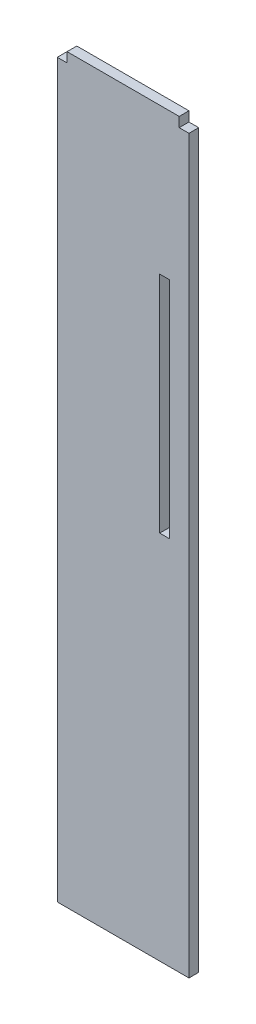
ISO-10303-21;
HEADER;
FILE_DESCRIPTION(('STEP AP214'),'2;1');
FILE_NAME('part.step','',(''),(''),'','','');
FILE_SCHEMA(('AUTOMOTIVE_DESIGN { 1 0 10303 214 1 1 1 1 }'));
ENDSEC;
DATA;
#1=APPLICATION_CONTEXT('core data for automotive mechanical design processes');
#2=APPLICATION_PROTOCOL_DEFINITION('international standard','automotive_design',2000,#1);
#3=PRODUCT_CONTEXT('',#1,'mechanical');
#4=PRODUCT('Part','Part','',(#3));
#5=PRODUCT_RELATED_PRODUCT_CATEGORY('part','',(#4));
#6=PRODUCT_DEFINITION_FORMATION('','',#4);
#7=PRODUCT_DEFINITION_CONTEXT('part definition',#1,'design');
#8=PRODUCT_DEFINITION('design','',#6,#7);
#9=PRODUCT_DEFINITION_SHAPE('','',#8);
#10=(LENGTH_UNIT() NAMED_UNIT(*) SI_UNIT(.MILLI.,.METRE.));
#11=(NAMED_UNIT(*) PLANE_ANGLE_UNIT() SI_UNIT($,.RADIAN.));
#12=(NAMED_UNIT(*) SI_UNIT($,.STERADIAN.) SOLID_ANGLE_UNIT());
#13=UNCERTAINTY_MEASURE_WITH_UNIT(LENGTH_MEASURE(1.E-05),#10,'distance_accuracy_value','');
#14=(GEOMETRIC_REPRESENTATION_CONTEXT(3) GLOBAL_UNCERTAINTY_ASSIGNED_CONTEXT((#13)) GLOBAL_UNIT_ASSIGNED_CONTEXT((#10,
#11,#12)) REPRESENTATION_CONTEXT('',''));
#15=CARTESIAN_POINT('',(0.,0.,0.));
#16=DIRECTION('',(0.,0.,1.));
#17=DIRECTION('',(1.,0.,0.));
#18=AXIS2_PLACEMENT_3D('',#15,#16,#17);
#19=CARTESIAN_POINT('',(0.,0.,4.));
#20=DIRECTION('',(1.,0.,0.));
#21=DIRECTION('',(0.,0.,-1.));
#22=AXIS2_PLACEMENT_3D('',#19,#20,#21);
#23=PLANE('',#22);
#24=DIRECTION('',(0.,-1.,0.));
#25=VECTOR('',#24,1.);
#26=CARTESIAN_POINT('',(0.,0.,0.));
#27=LINE('',#26,#25);
#28=CARTESIAN_POINT('',(0.,300.,0.));
#29=VERTEX_POINT('',#28);
#30=CARTESIAN_POINT('',(0.,0.,0.));
#31=VERTEX_POINT('',#30);
#32=EDGE_CURVE('E154',#29,#31,#27,.T.);
#33=ORIENTED_EDGE('',*,*,#32,.T.);
#34=DIRECTION('',(0.,0.,-1.));
#35=VECTOR('',#34,1.);
#36=CARTESIAN_POINT('',(0.,0.,4.));
#37=LINE('',#36,#35);
#38=CARTESIAN_POINT('',(0.,0.,4.));
#39=VERTEX_POINT('',#38);
#40=EDGE_CURVE('E11',#39,#31,#37,.T.);
#41=ORIENTED_EDGE('',*,*,#40,.F.);
#42=DIRECTION('',(0.,-1.,0.));
#43=VECTOR('',#42,1.);
#44=CARTESIAN_POINT('',(0.,0.,4.));
#45=LINE('',#44,#43);
#46=CARTESIAN_POINT('',(0.,300.,4.));
#47=VERTEX_POINT('',#46);
#48=EDGE_CURVE('E158',#47,#39,#45,.T.);
#49=ORIENTED_EDGE('',*,*,#48,.F.);
#50=DIRECTION('',(0.,0.,-1.));
#51=VECTOR('',#50,1.);
#52=CARTESIAN_POINT('',(0.,300.,4.));
#53=LINE('',#52,#51);
#54=EDGE_CURVE('E176',#47,#29,#53,.T.);
#55=ORIENTED_EDGE('',*,*,#54,.T.);
#56=EDGE_LOOP('',(#33,#41,#49,#55));
#57=FACE_BOUND('',#56,.T.);
#58=ADVANCED_FACE('F33',(#57),#23,.F.);
#59=CARTESIAN_POINT('',(0.,0.,4.));
#60=DIRECTION('',(0.,1.,0.));
#61=DIRECTION('',(0.,0.,1.));
#62=AXIS2_PLACEMENT_3D('',#59,#60,#61);
#63=PLANE('',#62);
#64=DIRECTION('',(1.,0.,0.));
#65=VECTOR('',#64,1.);
#66=CARTESIAN_POINT('',(0.,0.,0.));
#67=LINE('',#66,#65);
#68=CARTESIAN_POINT('',(54.,0.,0.));
#69=VERTEX_POINT('',#68);
#70=EDGE_CURVE('E179',#31,#69,#67,.T.);
#71=ORIENTED_EDGE('',*,*,#70,.T.);
#72=DIRECTION('',(0.,0.,-1.));
#73=VECTOR('',#72,1.);
#74=CARTESIAN_POINT('',(54.,0.,4.));
#75=LINE('',#74,#73);
#76=CARTESIAN_POINT('',(54.,0.,4.));
#77=VERTEX_POINT('',#76);
#78=EDGE_CURVE('E40',#77,#69,#75,.T.);
#79=ORIENTED_EDGE('',*,*,#78,.F.);
#80=DIRECTION('',(1.,0.,0.));
#81=VECTOR('',#80,1.);
#82=CARTESIAN_POINT('',(0.,0.,4.));
#83=LINE('',#82,#81);
#84=EDGE_CURVE('E161',#39,#77,#83,.T.);
#85=ORIENTED_EDGE('',*,*,#84,.F.);
#86=ORIENTED_EDGE('',*,*,#40,.T.);
#87=EDGE_LOOP('',(#71,#79,#85,#86));
#88=FACE_BOUND('',#87,.T.);
#89=ADVANCED_FACE('F234',(#88),#63,.F.);
#90=CARTESIAN_POINT('',(54.,0.,4.));
#91=DIRECTION('',(-1.,0.,0.));
#92=DIRECTION('',(0.,0.,1.));
#93=AXIS2_PLACEMENT_3D('',#90,#91,#92);
#94=PLANE('',#93);
#95=DIRECTION('',(0.,1.,0.));
#96=VECTOR('',#95,1.);
#97=CARTESIAN_POINT('',(54.,0.,0.));
#98=LINE('',#97,#96);
#99=CARTESIAN_POINT('',(54.,300.,0.));
#100=VERTEX_POINT('',#99);
#101=EDGE_CURVE('E181',#69,#100,#98,.T.);
#102=ORIENTED_EDGE('',*,*,#101,.T.);
#103=DIRECTION('',(0.,0.,-1.));
#104=VECTOR('',#103,1.);
#105=CARTESIAN_POINT('',(54.,300.,4.));
#106=LINE('',#105,#104);
#107=CARTESIAN_POINT('',(54.,300.,4.));
#108=VERTEX_POINT('',#107);
#109=EDGE_CURVE('E206',#108,#100,#106,.T.);
#110=ORIENTED_EDGE('',*,*,#109,.F.);
#111=DIRECTION('',(0.,1.,0.));
#112=VECTOR('',#111,1.);
#113=CARTESIAN_POINT('',(54.,0.,4.));
#114=LINE('',#113,#112);
#115=EDGE_CURVE('E164',#77,#108,#114,.T.);
#116=ORIENTED_EDGE('',*,*,#115,.F.);
#117=ORIENTED_EDGE('',*,*,#78,.T.);
#118=EDGE_LOOP('',(#102,#110,#116,#117));
#119=FACE_BOUND('',#118,.T.);
#120=ADVANCED_FACE('F213',(#119),#94,.F.);
#121=CARTESIAN_POINT('',(50.,300.,4.));
#122=DIRECTION('',(0.,-1.,0.));
#123=DIRECTION('',(0.,0.,-1.));
#124=AXIS2_PLACEMENT_3D('',#121,#122,#123);
#125=PLANE('',#124);
#126=DIRECTION('',(-1.,0.,0.));
#127=VECTOR('',#126,1.);
#128=CARTESIAN_POINT('',(50.,300.,0.));
#129=LINE('',#128,#127);
#130=CARTESIAN_POINT('',(50.,300.,0.));
#131=VERTEX_POINT('',#130);
#132=EDGE_CURVE('E183',#100,#131,#129,.T.);
#133=ORIENTED_EDGE('',*,*,#132,.T.);
#134=DIRECTION('',(0.,0.,-1.));
#135=VECTOR('',#134,1.);
#136=CARTESIAN_POINT('',(50.,300.,4.));
#137=LINE('',#136,#135);
#138=CARTESIAN_POINT('',(50.,300.,4.));
#139=VERTEX_POINT('',#138);
#140=EDGE_CURVE('E203',#139,#131,#137,.T.);
#141=ORIENTED_EDGE('',*,*,#140,.F.);
#142=DIRECTION('',(-1.,0.,0.));
#143=VECTOR('',#142,1.);
#144=CARTESIAN_POINT('',(50.,300.,4.));
#145=LINE('',#144,#143);
#146=EDGE_CURVE('E166',#108,#139,#145,.T.);
#147=ORIENTED_EDGE('',*,*,#146,.F.);
#148=ORIENTED_EDGE('',*,*,#109,.T.);
#149=EDGE_LOOP('',(#133,#141,#147,#148));
#150=FACE_BOUND('',#149,.T.);
#151=ADVANCED_FACE('F222',(#150),#125,.F.);
#152=CARTESIAN_POINT('',(50.,304.,4.));
#153=DIRECTION('',(-1.,0.,0.));
#154=DIRECTION('',(0.,0.,1.));
#155=AXIS2_PLACEMENT_3D('',#152,#153,#154);
#156=PLANE('',#155);
#157=DIRECTION('',(0.,1.,0.));
#158=VECTOR('',#157,1.);
#159=CARTESIAN_POINT('',(50.,304.,0.));
#160=LINE('',#159,#158);
#161=CARTESIAN_POINT('',(50.,304.,0.));
#162=VERTEX_POINT('',#161);
#163=EDGE_CURVE('E185',#131,#162,#160,.T.);
#164=ORIENTED_EDGE('',*,*,#163,.T.);
#165=DIRECTION('',(0.,0.,-1.));
#166=VECTOR('',#165,1.);
#167=CARTESIAN_POINT('',(50.,304.,4.));
#168=LINE('',#167,#166);
#169=CARTESIAN_POINT('',(50.,304.,4.));
#170=VERTEX_POINT('',#169);
#171=EDGE_CURVE('E200',#170,#162,#168,.T.);
#172=ORIENTED_EDGE('',*,*,#171,.F.);
#173=DIRECTION('',(0.,1.,0.));
#174=VECTOR('',#173,1.);
#175=CARTESIAN_POINT('',(50.,304.,4.));
#176=LINE('',#175,#174);
#177=EDGE_CURVE('E168',#139,#170,#176,.T.);
#178=ORIENTED_EDGE('',*,*,#177,.F.);
#179=ORIENTED_EDGE('',*,*,#140,.T.);
#180=EDGE_LOOP('',(#164,#172,#178,#179));
#181=FACE_BOUND('',#180,.T.);
#182=ADVANCED_FACE('F226',(#181),#156,.F.);
#183=CARTESIAN_POINT('',(4.,304.,4.));
#184=DIRECTION('',(0.,-1.,0.));
#185=DIRECTION('',(0.,0.,-1.));
#186=AXIS2_PLACEMENT_3D('',#183,#184,#185);
#187=PLANE('',#186);
#188=DIRECTION('',(-1.,0.,0.));
#189=VECTOR('',#188,1.);
#190=CARTESIAN_POINT('',(4.,304.,0.));
#191=LINE('',#190,#189);
#192=CARTESIAN_POINT('',(4.,304.,0.));
#193=VERTEX_POINT('',#192);
#194=EDGE_CURVE('E187',#162,#193,#191,.T.);
#195=ORIENTED_EDGE('',*,*,#194,.T.);
#196=DIRECTION('',(0.,0.,-1.));
#197=VECTOR('',#196,1.);
#198=CARTESIAN_POINT('',(4.,304.,4.));
#199=LINE('',#198,#197);
#200=CARTESIAN_POINT('',(4.,304.,4.));
#201=VERTEX_POINT('',#200);
#202=EDGE_CURVE('E197',#201,#193,#199,.T.);
#203=ORIENTED_EDGE('',*,*,#202,.F.);
#204=DIRECTION('',(-1.,0.,0.));
#205=VECTOR('',#204,1.);
#206=CARTESIAN_POINT('',(4.,304.,4.));
#207=LINE('',#206,#205);
#208=EDGE_CURVE('E170',#170,#201,#207,.T.);
#209=ORIENTED_EDGE('',*,*,#208,.F.);
#210=ORIENTED_EDGE('',*,*,#171,.T.);
#211=EDGE_LOOP('',(#195,#203,#209,#210));
#212=FACE_BOUND('',#211,.T.);
#213=ADVANCED_FACE('F247',(#212),#187,.F.);
#214=CARTESIAN_POINT('',(4.,300.,4.));
#215=DIRECTION('',(1.,0.,0.));
#216=DIRECTION('',(0.,0.,-1.));
#217=AXIS2_PLACEMENT_3D('',#214,#215,#216);
#218=PLANE('',#217);
#219=DIRECTION('',(0.,-1.,0.));
#220=VECTOR('',#219,1.);
#221=CARTESIAN_POINT('',(4.,300.,0.));
#222=LINE('',#221,#220);
#223=CARTESIAN_POINT('',(4.,300.,0.));
#224=VERTEX_POINT('',#223);
#225=EDGE_CURVE('E189',#193,#224,#222,.T.);
#226=ORIENTED_EDGE('',*,*,#225,.T.);
#227=DIRECTION('',(0.,0.,-1.));
#228=VECTOR('',#227,1.);
#229=CARTESIAN_POINT('',(4.,300.,4.));
#230=LINE('',#229,#228);
#231=CARTESIAN_POINT('',(4.,300.,4.));
#232=VERTEX_POINT('',#231);
#233=EDGE_CURVE('E194',#232,#224,#230,.T.);
#234=ORIENTED_EDGE('',*,*,#233,.F.);
#235=DIRECTION('',(0.,-1.,0.));
#236=VECTOR('',#235,1.);
#237=CARTESIAN_POINT('',(4.,300.,4.));
#238=LINE('',#237,#236);
#239=EDGE_CURVE('E172',#201,#232,#238,.T.);
#240=ORIENTED_EDGE('',*,*,#239,.F.);
#241=ORIENTED_EDGE('',*,*,#202,.T.);
#242=EDGE_LOOP('',(#226,#234,#240,#241));
#243=FACE_BOUND('',#242,.T.);
#244=ADVANCED_FACE('F245',(#243),#218,.F.);
#245=CARTESIAN_POINT('',(0.,300.,4.));
#246=DIRECTION('',(0.,-1.,0.));
#247=DIRECTION('',(0.,0.,-1.));
#248=AXIS2_PLACEMENT_3D('',#245,#246,#247);
#249=PLANE('',#248);
#250=DIRECTION('',(-1.,0.,0.));
#251=VECTOR('',#250,1.);
#252=CARTESIAN_POINT('',(0.,300.,0.));
#253=LINE('',#252,#251);
#254=EDGE_CURVE('E162',#224,#29,#253,.T.);
#255=ORIENTED_EDGE('',*,*,#254,.T.);
#256=ORIENTED_EDGE('',*,*,#54,.F.);
#257=DIRECTION('',(-1.,0.,0.));
#258=VECTOR('',#257,1.);
#259=CARTESIAN_POINT('',(0.,300.,4.));
#260=LINE('',#259,#258);
#261=EDGE_CURVE('E174',#232,#47,#260,.T.);
#262=ORIENTED_EDGE('',*,*,#261,.F.);
#263=ORIENTED_EDGE('',*,*,#233,.T.);
#264=EDGE_LOOP('',(#255,#256,#262,#263));
#265=FACE_BOUND('',#264,.T.);
#266=ADVANCED_FACE('F240',(#265),#249,.F.);
#267=CARTESIAN_POINT('',(0.,0.,4.));
#268=DIRECTION('',(0.,0.,-1.));
#269=DIRECTION('',(-1.,0.,0.));
#270=AXIS2_PLACEMENT_3D('',#267,#268,#269);
#271=PLANE('',#270);
#272=DIRECTION('',(-1.,0.,0.));
#273=VECTOR('',#272,1.);
#274=CARTESIAN_POINT('',(46.,244.,4.));
#275=LINE('',#274,#273);
#276=CARTESIAN_POINT('',(46.,244.,4.));
#277=VERTEX_POINT('',#276);
#278=CARTESIAN_POINT('',(42.,244.,4.));
#279=VERTEX_POINT('',#278);
#280=EDGE_CURVE('E148',#277,#279,#275,.T.);
#281=ORIENTED_EDGE('',*,*,#280,.F.);
#282=DIRECTION('',(0.,1.,0.));
#283=VECTOR('',#282,1.);
#284=CARTESIAN_POINT('',(46.,244.,4.));
#285=LINE('',#284,#283);
#286=CARTESIAN_POINT('',(46.,152.,4.));
#287=VERTEX_POINT('',#286);
#288=EDGE_CURVE('E47',#287,#277,#285,.T.);
#289=ORIENTED_EDGE('',*,*,#288,.F.);
#290=DIRECTION('',(1.,0.,0.));
#291=VECTOR('',#290,1.);
#292=CARTESIAN_POINT('',(46.,152.,4.));
#293=LINE('',#292,#291);
#294=CARTESIAN_POINT('',(42.,152.,4.));
#295=VERTEX_POINT('',#294);
#296=EDGE_CURVE('E139',#295,#287,#293,.T.);
#297=ORIENTED_EDGE('',*,*,#296,.F.);
#298=DIRECTION('',(0.,-1.,0.));
#299=VECTOR('',#298,1.);
#300=CARTESIAN_POINT('',(42.,244.,4.));
#301=LINE('',#300,#299);
#302=EDGE_CURVE('E142',#279,#295,#301,.T.);
#303=ORIENTED_EDGE('',*,*,#302,.F.);
#304=EDGE_LOOP('',(#281,#289,#297,#303));
#305=FACE_BOUND('',#304,.T.);
#306=ORIENTED_EDGE('',*,*,#48,.T.);
#307=ORIENTED_EDGE('',*,*,#84,.T.);
#308=ORIENTED_EDGE('',*,*,#115,.T.);
#309=ORIENTED_EDGE('',*,*,#146,.T.);
#310=ORIENTED_EDGE('',*,*,#177,.T.);
#311=ORIENTED_EDGE('',*,*,#208,.T.);
#312=ORIENTED_EDGE('',*,*,#239,.T.);
#313=ORIENTED_EDGE('',*,*,#261,.T.);
#314=EDGE_LOOP('',(#306,#307,#308,#309,#310,#311,#312,#313));
#315=FACE_BOUND('',#314,.T.);
#316=ADVANCED_FACE('F230',(#305,#315),#271,.F.);
#317=CARTESIAN_POINT('',(0.,0.,0.));
#318=DIRECTION('',(0.,0.,-1.));
#319=DIRECTION('',(-1.,0.,0.));
#320=AXIS2_PLACEMENT_3D('',#317,#318,#319);
#321=PLANE('',#320);
#322=DIRECTION('',(0.,1.,0.));
#323=VECTOR('',#322,1.);
#324=CARTESIAN_POINT('',(46.,244.,0.));
#325=LINE('',#324,#323);
#326=CARTESIAN_POINT('',(46.,152.,0.));
#327=VERTEX_POINT('',#326);
#328=CARTESIAN_POINT('',(46.,244.,0.));
#329=VERTEX_POINT('',#328);
#330=EDGE_CURVE('E123',#327,#329,#325,.T.);
#331=ORIENTED_EDGE('',*,*,#330,.T.);
#332=DIRECTION('',(-1.,0.,0.));
#333=VECTOR('',#332,1.);
#334=CARTESIAN_POINT('',(46.,244.,0.));
#335=LINE('',#334,#333);
#336=CARTESIAN_POINT('',(42.,244.,0.));
#337=VERTEX_POINT('',#336);
#338=EDGE_CURVE('E132',#329,#337,#335,.T.);
#339=ORIENTED_EDGE('',*,*,#338,.T.);
#340=DIRECTION('',(0.,-1.,0.));
#341=VECTOR('',#340,1.);
#342=CARTESIAN_POINT('',(42.,244.,0.));
#343=LINE('',#342,#341);
#344=CARTESIAN_POINT('',(42.,152.,0.));
#345=VERTEX_POINT('',#344);
#346=EDGE_CURVE('E55',#337,#345,#343,.T.);
#347=ORIENTED_EDGE('',*,*,#346,.T.);
#348=DIRECTION('',(1.,0.,0.));
#349=VECTOR('',#348,1.);
#350=CARTESIAN_POINT('',(46.,152.,0.));
#351=LINE('',#350,#349);
#352=EDGE_CURVE('E129',#345,#327,#351,.T.);
#353=ORIENTED_EDGE('',*,*,#352,.T.);
#354=EDGE_LOOP('',(#331,#339,#347,#353));
#355=FACE_BOUND('',#354,.T.);
#356=ORIENTED_EDGE('',*,*,#32,.F.);
#357=ORIENTED_EDGE('',*,*,#254,.F.);
#358=ORIENTED_EDGE('',*,*,#225,.F.);
#359=ORIENTED_EDGE('',*,*,#194,.F.);
#360=ORIENTED_EDGE('',*,*,#163,.F.);
#361=ORIENTED_EDGE('',*,*,#132,.F.);
#362=ORIENTED_EDGE('',*,*,#101,.F.);
#363=ORIENTED_EDGE('',*,*,#70,.F.);
#364=EDGE_LOOP('',(#356,#357,#358,#359,#360,#361,#362,#363));
#365=FACE_BOUND('',#364,.T.);
#366=ADVANCED_FACE('F136',(#355,#365),#321,.T.);
#367=CARTESIAN_POINT('',(46.,244.,0.));
#368=DIRECTION('',(1.,0.,0.));
#369=DIRECTION('',(0.,1.,0.));
#370=AXIS2_PLACEMENT_3D('',#367,#368,#369);
#371=PLANE('',#370);
#372=ORIENTED_EDGE('',*,*,#288,.T.);
#373=DIRECTION('',(0.,0.,1.));
#374=VECTOR('',#373,1.);
#375=CARTESIAN_POINT('',(46.,244.,0.));
#376=LINE('',#375,#374);
#377=EDGE_CURVE('E119',#329,#277,#376,.T.);
#378=ORIENTED_EDGE('',*,*,#377,.F.);
#379=ORIENTED_EDGE('',*,*,#330,.F.);
#380=DIRECTION('',(0.,0.,1.));
#381=VECTOR('',#380,1.);
#382=CARTESIAN_POINT('',(46.,152.,0.));
#383=LINE('',#382,#381);
#384=EDGE_CURVE('E152',#327,#287,#383,.T.);
#385=ORIENTED_EDGE('',*,*,#384,.T.);
#386=EDGE_LOOP('',(#372,#378,#379,#385));
#387=FACE_BOUND('',#386,.T.);
#388=ADVANCED_FACE('F121',(#387),#371,.F.);
#389=CARTESIAN_POINT('',(46.,152.,0.));
#390=DIRECTION('',(0.,-1.,0.));
#391=DIRECTION('',(0.,0.,-1.));
#392=AXIS2_PLACEMENT_3D('',#389,#390,#391);
#393=PLANE('',#392);
#394=ORIENTED_EDGE('',*,*,#296,.T.);
#395=ORIENTED_EDGE('',*,*,#384,.F.);
#396=ORIENTED_EDGE('',*,*,#352,.F.);
#397=DIRECTION('',(0.,0.,1.));
#398=VECTOR('',#397,1.);
#399=CARTESIAN_POINT('',(42.,152.,0.));
#400=LINE('',#399,#398);
#401=EDGE_CURVE('E155',#345,#295,#400,.T.);
#402=ORIENTED_EDGE('',*,*,#401,.T.);
#403=EDGE_LOOP('',(#394,#395,#396,#402));
#404=FACE_BOUND('',#403,.T.);
#405=ADVANCED_FACE('F318',(#404),#393,.F.);
#406=CARTESIAN_POINT('',(42.,244.,0.));
#407=DIRECTION('',(-1.,0.,0.));
#408=DIRECTION('',(0.,-1.,0.));
#409=AXIS2_PLACEMENT_3D('',#406,#407,#408);
#410=PLANE('',#409);
#411=ORIENTED_EDGE('',*,*,#302,.T.);
#412=ORIENTED_EDGE('',*,*,#401,.F.);
#413=ORIENTED_EDGE('',*,*,#346,.F.);
#414=DIRECTION('',(0.,0.,1.));
#415=VECTOR('',#414,1.);
#416=CARTESIAN_POINT('',(42.,244.,0.));
#417=LINE('',#416,#415);
#418=EDGE_CURVE('E128',#337,#279,#417,.T.);
#419=ORIENTED_EDGE('',*,*,#418,.T.);
#420=EDGE_LOOP('',(#411,#412,#413,#419));
#421=FACE_BOUND('',#420,.T.);
#422=ADVANCED_FACE('F327',(#421),#410,.F.);
#423=CARTESIAN_POINT('',(46.,244.,0.));
#424=DIRECTION('',(0.,1.,0.));
#425=DIRECTION('',(0.,0.,1.));
#426=AXIS2_PLACEMENT_3D('',#423,#424,#425);
#427=PLANE('',#426);
#428=ORIENTED_EDGE('',*,*,#280,.T.);
#429=ORIENTED_EDGE('',*,*,#418,.F.);
#430=ORIENTED_EDGE('',*,*,#338,.F.);
#431=ORIENTED_EDGE('',*,*,#377,.T.);
#432=EDGE_LOOP('',(#428,#429,#430,#431));
#433=FACE_BOUND('',#432,.T.);
#434=ADVANCED_FACE('F133',(#433),#427,.F.);
#435=CLOSED_SHELL('',(#58,#89,#120,#151,#182,#213,#244,#266,#316,#366,#388,#405,#422,#434));
#436=MANIFOLD_SOLID_BREP('B2',#435);
#437=ADVANCED_BREP_SHAPE_REPRESENTATION('',(#18,#436),#14);
#438=SHAPE_DEFINITION_REPRESENTATION(#9,#437);
ENDSEC;
END-ISO-10303-21;
